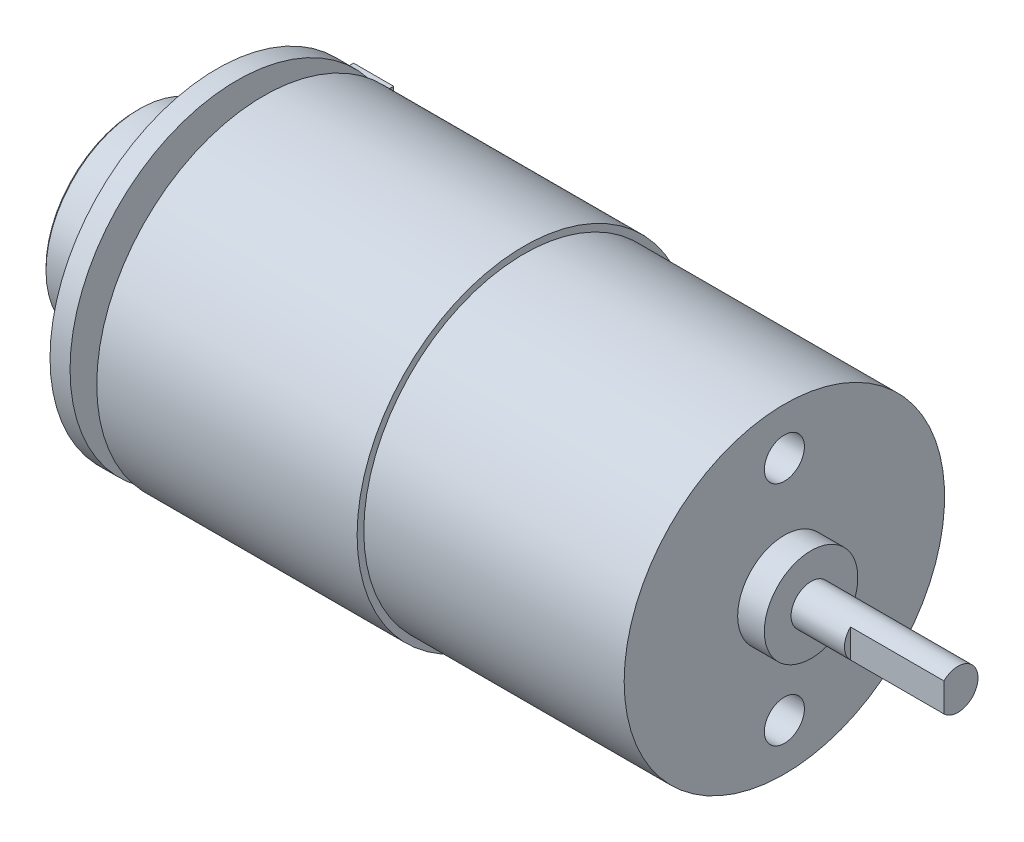
ISO-10303-21;
HEADER;
FILE_DESCRIPTION(('STEP AP214'),'2;1');
FILE_NAME('part.step','',(''),(''),'','','');
FILE_SCHEMA(('AUTOMOTIVE_DESIGN { 1 0 10303 214 1 1 1 1 }'));
ENDSEC;
DATA;
#1=APPLICATION_CONTEXT('core data for automotive mechanical design processes');
#2=APPLICATION_PROTOCOL_DEFINITION('international standard','automotive_design',2000,#1);
#3=PRODUCT_CONTEXT('',#1,'mechanical');
#4=PRODUCT('Part','Part','',(#3));
#5=PRODUCT_RELATED_PRODUCT_CATEGORY('part','',(#4));
#6=PRODUCT_DEFINITION_FORMATION('','',#4);
#7=PRODUCT_DEFINITION_CONTEXT('part definition',#1,'design');
#8=PRODUCT_DEFINITION('design','',#6,#7);
#9=PRODUCT_DEFINITION_SHAPE('','',#8);
#10=(LENGTH_UNIT() NAMED_UNIT(*) SI_UNIT(.MILLI.,.METRE.));
#11=(NAMED_UNIT(*) PLANE_ANGLE_UNIT() SI_UNIT($,.RADIAN.));
#12=(NAMED_UNIT(*) SI_UNIT($,.STERADIAN.) SOLID_ANGLE_UNIT());
#13=UNCERTAINTY_MEASURE_WITH_UNIT(LENGTH_MEASURE(1.E-05),#10,'distance_accuracy_value','');
#14=(GEOMETRIC_REPRESENTATION_CONTEXT(3) GLOBAL_UNCERTAINTY_ASSIGNED_CONTEXT((#13)) GLOBAL_UNIT_ASSIGNED_CONTEXT((#10,
#11,#12)) REPRESENTATION_CONTEXT('',''));
#15=CARTESIAN_POINT('',(0.,0.,0.));
#16=DIRECTION('',(0.,0.,1.));
#17=DIRECTION('',(1.,0.,0.));
#18=AXIS2_PLACEMENT_3D('',#15,#16,#17);
#19=CARTESIAN_POINT('',(-23.,0.,0.));
#20=DIRECTION('',(-1.,0.,0.));
#21=DIRECTION('',(0.,0.,1.));
#22=AXIS2_PLACEMENT_3D('',#19,#20,#21);
#23=PLANE('',#22);
#24=CARTESIAN_POINT('',(-23.,0.,0.));
#25=DIRECTION('',(-1.,0.,0.));
#26=DIRECTION('',(0.,0.,1.));
#27=AXIS2_PLACEMENT_3D('',#24,#25,#26);
#28=CIRCLE('',#27,0.5);
#29=CARTESIAN_POINT('',(-23.,0.,0.5));
#30=VERTEX_POINT('',#29);
#31=EDGE_CURVE('E419',#30,#30,#28,.T.);
#32=ORIENTED_EDGE('',*,*,#31,.F.);
#33=EDGE_LOOP('',(#32));
#34=FACE_BOUND('',#33,.T.);
#35=CARTESIAN_POINT('',(-23.,0.,0.));
#36=DIRECTION('',(-1.,0.,0.));
#37=DIRECTION('',(0.,0.,1.));
#38=AXIS2_PLACEMENT_3D('',#35,#36,#37);
#39=CIRCLE('',#38,12.5);
#40=CARTESIAN_POINT('',(-23.,-4.74918821401504,-11.5626645418719));
#41=VERTEX_POINT('',#40);
#42=CARTESIAN_POINT('',(-23.,4.74918821401504,-11.5626645418719));
#43=VERTEX_POINT('',#42);
#44=EDGE_CURVE('E416',#41,#43,#39,.T.);
#45=ORIENTED_EDGE('',*,*,#44,.T.);
#46=DIRECTION('',(0.,0.,-1.));
#47=VECTOR('',#46,1.);
#48=CARTESIAN_POINT('',(-23.,4.74918821401504,-8.23495804949627));
#49=LINE('',#48,#47);
#50=CARTESIAN_POINT('',(-23.,4.74918821401504,-8.23495804949627));
#51=VERTEX_POINT('',#50);
#52=EDGE_CURVE('E446',#51,#43,#49,.T.);
#53=ORIENTED_EDGE('',*,*,#52,.F.);
#54=DIRECTION('',(0.,1.,0.));
#55=VECTOR('',#54,1.);
#56=CARTESIAN_POINT('',(-23.,-4.74918821401504,-8.23495804949627));
#57=LINE('',#56,#55);
#58=CARTESIAN_POINT('',(-23.,-4.74918821401504,-8.23495804949627));
#59=VERTEX_POINT('',#58);
#60=EDGE_CURVE('E438',#59,#51,#57,.T.);
#61=ORIENTED_EDGE('',*,*,#60,.F.);
#62=DIRECTION('',(0.,0.,-1.));
#63=VECTOR('',#62,1.);
#64=CARTESIAN_POINT('',(-23.,-4.74918821401504,0.));
#65=LINE('',#64,#63);
#66=EDGE_CURVE('E164',#59,#41,#65,.T.);
#67=ORIENTED_EDGE('',*,*,#66,.T.);
#68=EDGE_LOOP('',(#45,#53,#61,#67));
#69=FACE_BOUND('',#68,.T.);
#70=ADVANCED_FACE('F39',(#34,#69),#23,.T.);
#71=CARTESIAN_POINT('',(-19.5,12.5,0.));
#72=DIRECTION('',(1.,0.,0.));
#73=DIRECTION('',(0.,0.,-1.));
#74=AXIS2_PLACEMENT_3D('',#71,#72,#73);
#75=PLANE('',#74);
#76=DIRECTION('',(0.,1.,0.));
#77=VECTOR('',#76,1.);
#78=CARTESIAN_POINT('',(-19.5,1.5,-9.15466330411358));
#79=LINE('',#78,#77);
#80=CARTESIAN_POINT('',(-19.5,-1.5,-9.15466330411358));
#81=VERTEX_POINT('',#80);
#82=CARTESIAN_POINT('',(-19.5,1.5,-9.15466330411358));
#83=VERTEX_POINT('',#82);
#84=EDGE_CURVE('E363',#81,#83,#79,.T.);
#85=ORIENTED_EDGE('',*,*,#84,.F.);
#86=DIRECTION('',(0.,0.,1.));
#87=VECTOR('',#86,1.);
#88=CARTESIAN_POINT('',(-19.5,-1.5,-9.65466330411358));
#89=LINE('',#88,#87);
#90=CARTESIAN_POINT('',(-19.5,-1.5,-9.65466330411358));
#91=VERTEX_POINT('',#90);
#92=EDGE_CURVE('E353',#91,#81,#89,.T.);
#93=ORIENTED_EDGE('',*,*,#92,.F.);
#94=DIRECTION('',(0.,-1.,0.));
#95=VECTOR('',#94,1.);
#96=CARTESIAN_POINT('',(-19.5,1.5,-9.65466330411358));
#97=LINE('',#96,#95);
#98=CARTESIAN_POINT('',(-19.5,1.5,-9.65466330411358));
#99=VERTEX_POINT('',#98);
#100=EDGE_CURVE('E357',#99,#91,#97,.T.);
#101=ORIENTED_EDGE('',*,*,#100,.F.);
#102=DIRECTION('',(0.,0.,-1.));
#103=VECTOR('',#102,1.);
#104=CARTESIAN_POINT('',(-19.5,1.5,-9.65466330411358));
#105=LINE('',#104,#103);
#106=EDGE_CURVE('E360',#83,#99,#105,.T.);
#107=ORIENTED_EDGE('',*,*,#106,.F.);
#108=EDGE_LOOP('',(#85,#93,#101,#107));
#109=FACE_BOUND('',#108,.T.);
#110=CARTESIAN_POINT('',(-19.5,0.,0.));
#111=DIRECTION('',(-1.,0.,0.));
#112=DIRECTION('',(0.,0.,1.));
#113=AXIS2_PLACEMENT_3D('',#110,#111,#112);
#114=CIRCLE('',#113,12.5);
#115=CARTESIAN_POINT('',(-19.5,0.,12.5));
#116=VERTEX_POINT('',#115);
#117=EDGE_CURVE('E160',#116,#116,#114,.T.);
#118=ORIENTED_EDGE('',*,*,#117,.T.);
#119=EDGE_LOOP('',(#118));
#120=FACE_BOUND('',#119,.T.);
#121=DIRECTION('',(0.,1.,0.));
#122=VECTOR('',#121,1.);
#123=CARTESIAN_POINT('',(-19.5,1.5,9.65466330411358));
#124=LINE('',#123,#122);
#125=CARTESIAN_POINT('',(-19.5,-1.5,9.65466330411358));
#126=VERTEX_POINT('',#125);
#127=CARTESIAN_POINT('',(-19.5,1.5,9.65466330411358));
#128=VERTEX_POINT('',#127);
#129=EDGE_CURVE('E399',#126,#128,#124,.T.);
#130=ORIENTED_EDGE('',*,*,#129,.F.);
#131=DIRECTION('',(0.,0.,1.));
#132=VECTOR('',#131,1.);
#133=CARTESIAN_POINT('',(-19.5,-1.5,9.65466330411358));
#134=LINE('',#133,#132);
#135=CARTESIAN_POINT('',(-19.5,-1.5,9.15466330411358));
#136=VERTEX_POINT('',#135);
#137=EDGE_CURVE('E389',#136,#126,#134,.T.);
#138=ORIENTED_EDGE('',*,*,#137,.F.);
#139=DIRECTION('',(0.,-1.,0.));
#140=VECTOR('',#139,1.);
#141=CARTESIAN_POINT('',(-19.5,1.5,9.15466330411358));
#142=LINE('',#141,#140);
#143=CARTESIAN_POINT('',(-19.5,1.5,9.15466330411358));
#144=VERTEX_POINT('',#143);
#145=EDGE_CURVE('E393',#144,#136,#142,.T.);
#146=ORIENTED_EDGE('',*,*,#145,.F.);
#147=DIRECTION('',(0.,0.,-1.));
#148=VECTOR('',#147,1.);
#149=CARTESIAN_POINT('',(-19.5,1.5,9.65466330411358));
#150=LINE('',#149,#148);
#151=EDGE_CURVE('E396',#128,#144,#150,.T.);
#152=ORIENTED_EDGE('',*,*,#151,.F.);
#153=EDGE_LOOP('',(#130,#138,#146,#152));
#154=FACE_BOUND('',#153,.T.);
#155=ADVANCED_FACE('F204',(#109,#120,#154),#75,.F.);
#156=CARTESIAN_POINT('',(-61.9655819569152,0.,0.));
#157=DIRECTION('',(-1.,0.,0.));
#158=DIRECTION('',(0.,0.,1.));
#159=AXIS2_PLACEMENT_3D('',#156,#157,#158);
#160=CYLINDRICAL_SURFACE('',#159,12.5);
#161=ORIENTED_EDGE('',*,*,#117,.F.);
#162=EDGE_LOOP('',(#161));
#163=FACE_BOUND('',#162,.T.);
#164=CARTESIAN_POINT('',(0.,0.,0.));
#165=DIRECTION('',(-1.,0.,0.));
#166=DIRECTION('',(0.,0.,1.));
#167=AXIS2_PLACEMENT_3D('',#164,#165,#166);
#168=CIRCLE('',#167,12.5);
#169=CARTESIAN_POINT('',(0.,0.,12.5));
#170=VERTEX_POINT('',#169);
#171=EDGE_CURVE('E306',#170,#170,#168,.T.);
#172=ORIENTED_EDGE('',*,*,#171,.T.);
#173=EDGE_LOOP('',(#172));
#174=FACE_BOUND('',#173,.T.);
#175=ADVANCED_FACE('F210',(#163,#174),#160,.T.);
#176=CARTESIAN_POINT('',(32.5,0.,0.));
#177=DIRECTION('',(-1.,0.,0.));
#178=DIRECTION('',(0.,0.,1.));
#179=AXIS2_PLACEMENT_3D('',#176,#177,#178);
#180=PLANE('',#179);
#181=CARTESIAN_POINT('',(32.5,0.,0.));
#182=DIRECTION('',(-1.,0.,0.));
#183=DIRECTION('',(0.,0.,1.));
#184=AXIS2_PLACEMENT_3D('',#181,#182,#183);
#185=CIRCLE('',#184,1.5);
#186=CARTESIAN_POINT('',(32.5,1.07121426428143,1.05));
#187=VERTEX_POINT('',#186);
#188=CARTESIAN_POINT('',(32.5,-1.07121426428143,1.05));
#189=VERTEX_POINT('',#188);
#190=EDGE_CURVE('E158',#187,#189,#185,.T.);
#191=ORIENTED_EDGE('',*,*,#190,.F.);
#192=DIRECTION('',(0.,1.,0.));
#193=VECTOR('',#192,1.);
#194=CARTESIAN_POINT('',(32.5,-12.5,1.05));
#195=LINE('',#194,#193);
#196=EDGE_CURVE('E54',#189,#187,#195,.T.);
#197=ORIENTED_EDGE('',*,*,#196,.F.);
#198=EDGE_LOOP('',(#191,#197));
#199=FACE_BOUND('',#198,.T.);
#200=ADVANCED_FACE('F295',(#199),#180,.F.);
#201=CARTESIAN_POINT('',(-61.9655819569152,0.,0.));
#202=DIRECTION('',(-1.,0.,0.));
#203=DIRECTION('',(0.,0.,1.));
#204=AXIS2_PLACEMENT_3D('',#201,#202,#203);
#205=CYLINDRICAL_SURFACE('',#204,1.5);
#206=CARTESIAN_POINT('',(21.5,0.,0.));
#207=DIRECTION('',(-1.,0.,0.));
#208=DIRECTION('',(0.,0.,1.));
#209=AXIS2_PLACEMENT_3D('',#206,#207,#208);
#210=CIRCLE('',#209,1.5);
#211=CARTESIAN_POINT('',(21.5,0.,1.5));
#212=VERTEX_POINT('',#211);
#213=EDGE_CURVE('E161',#212,#212,#210,.T.);
#214=ORIENTED_EDGE('',*,*,#213,.F.);
#215=EDGE_LOOP('',(#214));
#216=FACE_BOUND('',#215,.T.);
#217=DIRECTION('',(-1.,0.,0.));
#218=VECTOR('',#217,1.);
#219=CARTESIAN_POINT('',(-61.9655819569152,-1.07121426428143,1.05));
#220=LINE('',#219,#218);
#221=CARTESIAN_POINT('',(25.5,-1.07121426428143,1.05));
#222=VERTEX_POINT('',#221);
#223=EDGE_CURVE('E11',#189,#222,#220,.T.);
#224=ORIENTED_EDGE('',*,*,#223,.T.);
#225=CARTESIAN_POINT('',(25.5,0.,0.));
#226=DIRECTION('',(-1.,0.,0.));
#227=DIRECTION('',(0.,0.,1.));
#228=AXIS2_PLACEMENT_3D('',#225,#226,#227);
#229=CIRCLE('',#228,1.5);
#230=CARTESIAN_POINT('',(25.5,1.07121426428143,1.05));
#231=VERTEX_POINT('',#230);
#232=EDGE_CURVE('E47',#222,#231,#229,.T.);
#233=ORIENTED_EDGE('',*,*,#232,.T.);
#234=DIRECTION('',(-1.,0.,0.));
#235=VECTOR('',#234,1.);
#236=CARTESIAN_POINT('',(-61.9655819569152,1.07121426428143,1.05));
#237=LINE('',#236,#235);
#238=EDGE_CURVE('E151',#231,#187,#237,.F.);
#239=ORIENTED_EDGE('',*,*,#238,.T.);
#240=ORIENTED_EDGE('',*,*,#190,.T.);
#241=EDGE_LOOP('',(#224,#233,#239,#240));
#242=FACE_BOUND('',#241,.T.);
#243=ADVANCED_FACE('F156',(#216,#242),#205,.T.);
#244=CARTESIAN_POINT('',(21.5,1.5,0.));
#245=DIRECTION('',(-1.,0.,0.));
#246=DIRECTION('',(0.,0.,1.));
#247=AXIS2_PLACEMENT_3D('',#244,#245,#246);
#248=PLANE('',#247);
#249=CARTESIAN_POINT('',(21.5,0.,0.));
#250=DIRECTION('',(-1.,0.,0.));
#251=DIRECTION('',(0.,0.,1.));
#252=AXIS2_PLACEMENT_3D('',#249,#250,#251);
#253=CIRCLE('',#252,3.5);
#254=CARTESIAN_POINT('',(21.5,0.,3.5));
#255=VERTEX_POINT('',#254);
#256=EDGE_CURVE('E167',#255,#255,#253,.T.);
#257=ORIENTED_EDGE('',*,*,#256,.F.);
#258=EDGE_LOOP('',(#257));
#259=FACE_BOUND('',#258,.T.);
#260=ORIENTED_EDGE('',*,*,#213,.T.);
#261=EDGE_LOOP('',(#260));
#262=FACE_BOUND('',#261,.T.);
#263=ADVANCED_FACE('F288',(#259,#262),#248,.F.);
#264=CARTESIAN_POINT('',(-61.9655819569152,0.,0.));
#265=DIRECTION('',(-1.,0.,0.));
#266=DIRECTION('',(0.,0.,1.));
#267=AXIS2_PLACEMENT_3D('',#264,#265,#266);
#268=CYLINDRICAL_SURFACE('',#267,3.5);
#269=CARTESIAN_POINT('',(19.5,0.,0.));
#270=DIRECTION('',(-1.,0.,0.));
#271=DIRECTION('',(0.,0.,1.));
#272=AXIS2_PLACEMENT_3D('',#269,#270,#271);
#273=CIRCLE('',#272,3.5);
#274=CARTESIAN_POINT('',(19.5,0.,3.5));
#275=VERTEX_POINT('',#274);
#276=EDGE_CURVE('E320',#275,#275,#273,.T.);
#277=ORIENTED_EDGE('',*,*,#276,.F.);
#278=EDGE_LOOP('',(#277));
#279=FACE_BOUND('',#278,.T.);
#280=ORIENTED_EDGE('',*,*,#256,.T.);
#281=EDGE_LOOP('',(#280));
#282=FACE_BOUND('',#281,.T.);
#283=ADVANCED_FACE('F284',(#279,#282),#268,.T.);
#284=CARTESIAN_POINT('',(19.5,3.5,0.));
#285=DIRECTION('',(-1.,0.,0.));
#286=DIRECTION('',(0.,0.,1.));
#287=AXIS2_PLACEMENT_3D('',#284,#285,#286);
#288=PLANE('',#287);
#289=CARTESIAN_POINT('',(19.5,8.5,0.));
#290=DIRECTION('',(1.,0.,0.));
#291=DIRECTION('',(0.,0.,1.));
#292=AXIS2_PLACEMENT_3D('',#289,#290,#291);
#293=CIRCLE('',#292,1.5);
#294=CARTESIAN_POINT('',(19.5,8.5,1.5));
#295=VERTEX_POINT('',#294);
#296=EDGE_CURVE('E335',#295,#295,#293,.T.);
#297=ORIENTED_EDGE('',*,*,#296,.F.);
#298=EDGE_LOOP('',(#297));
#299=FACE_BOUND('',#298,.T.);
#300=CARTESIAN_POINT('',(19.5,-8.5,0.));
#301=DIRECTION('',(1.,0.,0.));
#302=DIRECTION('',(0.,0.,-1.));
#303=AXIS2_PLACEMENT_3D('',#300,#301,#302);
#304=CIRCLE('',#303,1.5);
#305=CARTESIAN_POINT('',(19.5,-8.5,-1.5));
#306=VERTEX_POINT('',#305);
#307=EDGE_CURVE('E314',#306,#306,#304,.T.);
#308=ORIENTED_EDGE('',*,*,#307,.F.);
#309=EDGE_LOOP('',(#308));
#310=FACE_BOUND('',#309,.T.);
#311=CARTESIAN_POINT('',(19.5,0.,0.));
#312=DIRECTION('',(-1.,0.,0.));
#313=DIRECTION('',(0.,0.,1.));
#314=AXIS2_PLACEMENT_3D('',#311,#312,#313);
#315=CIRCLE('',#314,12.);
#316=CARTESIAN_POINT('',(19.5,0.,12.));
#317=VERTEX_POINT('',#316);
#318=EDGE_CURVE('E311',#317,#317,#315,.T.);
#319=ORIENTED_EDGE('',*,*,#318,.F.);
#320=EDGE_LOOP('',(#319));
#321=FACE_BOUND('',#320,.T.);
#322=ORIENTED_EDGE('',*,*,#276,.T.);
#323=EDGE_LOOP('',(#322));
#324=FACE_BOUND('',#323,.T.);
#325=ADVANCED_FACE('F280',(#299,#310,#321,#324),#288,.F.);
#326=CARTESIAN_POINT('',(-61.9655819569152,0.,0.));
#327=DIRECTION('',(-1.,0.,0.));
#328=DIRECTION('',(0.,0.,1.));
#329=AXIS2_PLACEMENT_3D('',#326,#327,#328);
#330=CYLINDRICAL_SURFACE('',#329,12.);
#331=CARTESIAN_POINT('',(0.,0.,0.));
#332=DIRECTION('',(-1.,0.,0.));
#333=DIRECTION('',(0.,0.,1.));
#334=AXIS2_PLACEMENT_3D('',#331,#332,#333);
#335=CIRCLE('',#334,12.);
#336=CARTESIAN_POINT('',(0.,0.,12.));
#337=VERTEX_POINT('',#336);
#338=EDGE_CURVE('E307',#337,#337,#335,.T.);
#339=ORIENTED_EDGE('',*,*,#338,.F.);
#340=EDGE_LOOP('',(#339));
#341=FACE_BOUND('',#340,.T.);
#342=ORIENTED_EDGE('',*,*,#318,.T.);
#343=EDGE_LOOP('',(#342));
#344=FACE_BOUND('',#343,.T.);
#345=ADVANCED_FACE('F276',(#341,#344),#330,.T.);
#346=CARTESIAN_POINT('',(0.,12.,0.));
#347=DIRECTION('',(-1.,0.,0.));
#348=DIRECTION('',(0.,0.,1.));
#349=AXIS2_PLACEMENT_3D('',#346,#347,#348);
#350=PLANE('',#349);
#351=ORIENTED_EDGE('',*,*,#171,.F.);
#352=EDGE_LOOP('',(#351));
#353=FACE_BOUND('',#352,.T.);
#354=ORIENTED_EDGE('',*,*,#338,.T.);
#355=EDGE_LOOP('',(#354));
#356=FACE_BOUND('',#355,.T.);
#357=ADVANCED_FACE('F272',(#353,#356),#350,.F.);
#358=CARTESIAN_POINT('',(16.5,-8.5,0.));
#359=DIRECTION('',(1.,0.,0.));
#360=DIRECTION('',(0.,0.,-1.));
#361=AXIS2_PLACEMENT_3D('',#358,#359,#360);
#362=CYLINDRICAL_SURFACE('',#361,1.5);
#363=CARTESIAN_POINT('',(16.5,-8.5,0.));
#364=DIRECTION('',(1.,0.,0.));
#365=DIRECTION('',(0.,0.,-1.));
#366=AXIS2_PLACEMENT_3D('',#363,#364,#365);
#367=CIRCLE('',#366,1.5);
#368=CARTESIAN_POINT('',(16.5,-8.5,-1.5));
#369=VERTEX_POINT('',#368);
#370=EDGE_CURVE('E308',#369,#369,#367,.T.);
#371=ORIENTED_EDGE('',*,*,#370,.F.);
#372=EDGE_LOOP('',(#371));
#373=FACE_BOUND('',#372,.T.);
#374=ORIENTED_EDGE('',*,*,#307,.T.);
#375=EDGE_LOOP('',(#374));
#376=FACE_BOUND('',#375,.T.);
#377=ADVANCED_FACE('F268',(#373,#376),#362,.F.);
#378=CARTESIAN_POINT('',(16.5,-8.5,0.));
#379=DIRECTION('',(1.,0.,0.));
#380=DIRECTION('',(0.,0.,-1.));
#381=AXIS2_PLACEMENT_3D('',#378,#379,#380);
#382=PLANE('',#381);
#383=ORIENTED_EDGE('',*,*,#370,.T.);
#384=EDGE_LOOP('',(#383));
#385=FACE_BOUND('',#384,.T.);
#386=ADVANCED_FACE('F264',(#385),#382,.T.);
#387=CARTESIAN_POINT('',(16.5,8.5,0.));
#388=DIRECTION('',(1.,0.,0.));
#389=DIRECTION('',(0.,0.,-1.));
#390=AXIS2_PLACEMENT_3D('',#387,#388,#389);
#391=CYLINDRICAL_SURFACE('',#390,1.5);
#392=CARTESIAN_POINT('',(16.5,8.5,0.));
#393=DIRECTION('',(1.,0.,0.));
#394=DIRECTION('',(0.,0.,1.));
#395=AXIS2_PLACEMENT_3D('',#392,#393,#394);
#396=CIRCLE('',#395,1.5);
#397=CARTESIAN_POINT('',(16.5,8.5,1.5));
#398=VERTEX_POINT('',#397);
#399=EDGE_CURVE('E333',#398,#398,#396,.T.);
#400=ORIENTED_EDGE('',*,*,#399,.F.);
#401=EDGE_LOOP('',(#400));
#402=FACE_BOUND('',#401,.T.);
#403=ORIENTED_EDGE('',*,*,#296,.T.);
#404=EDGE_LOOP('',(#403));
#405=FACE_BOUND('',#404,.T.);
#406=ADVANCED_FACE('F260',(#402,#405),#391,.F.);
#407=CARTESIAN_POINT('',(16.5,8.5,0.));
#408=DIRECTION('',(-1.,0.,0.));
#409=DIRECTION('',(0.,0.,1.));
#410=AXIS2_PLACEMENT_3D('',#407,#408,#409);
#411=PLANE('',#410);
#412=ORIENTED_EDGE('',*,*,#399,.T.);
#413=EDGE_LOOP('',(#412));
#414=FACE_BOUND('',#413,.T.);
#415=ADVANCED_FACE('F256',(#414),#411,.F.);
#416=CARTESIAN_POINT('',(-21.5,1.5,-9.15466330411358));
#417=DIRECTION('',(0.,0.,-1.));
#418=DIRECTION('',(-1.,0.,0.));
#419=AXIS2_PLACEMENT_3D('',#416,#417,#418);
#420=PLANE('',#419);
#421=ORIENTED_EDGE('',*,*,#84,.T.);
#422=DIRECTION('',(1.,0.,0.));
#423=VECTOR('',#422,1.);
#424=CARTESIAN_POINT('',(-21.5,1.5,-9.15466330411358));
#425=LINE('',#424,#423);
#426=CARTESIAN_POINT('',(-21.5,1.5,-9.15466330411358));
#427=VERTEX_POINT('',#426);
#428=EDGE_CURVE('E338',#427,#83,#425,.T.);
#429=ORIENTED_EDGE('',*,*,#428,.F.);
#430=DIRECTION('',(0.,1.,0.));
#431=VECTOR('',#430,1.);
#432=CARTESIAN_POINT('',(-21.5,1.5,-9.15466330411358));
#433=LINE('',#432,#431);
#434=CARTESIAN_POINT('',(-21.5,-1.5,-9.15466330411358));
#435=VERTEX_POINT('',#434);
#436=EDGE_CURVE('E356',#435,#427,#433,.T.);
#437=ORIENTED_EDGE('',*,*,#436,.F.);
#438=DIRECTION('',(1.,0.,0.));
#439=VECTOR('',#438,1.);
#440=CARTESIAN_POINT('',(-21.5,-1.5,-9.15466330411358));
#441=LINE('',#440,#439);
#442=EDGE_CURVE('E349',#435,#81,#441,.T.);
#443=ORIENTED_EDGE('',*,*,#442,.T.);
#444=EDGE_LOOP('',(#421,#429,#437,#443));
#445=FACE_BOUND('',#444,.T.);
#446=ADVANCED_FACE('F252',(#445),#420,.F.);
#447=CARTESIAN_POINT('',(-21.5,1.5,-9.65466330411358));
#448=DIRECTION('',(0.,-1.,0.));
#449=DIRECTION('',(0.,0.,-1.));
#450=AXIS2_PLACEMENT_3D('',#447,#448,#449);
#451=PLANE('',#450);
#452=ORIENTED_EDGE('',*,*,#106,.T.);
#453=DIRECTION('',(1.,0.,0.));
#454=VECTOR('',#453,1.);
#455=CARTESIAN_POINT('',(-21.5,1.5,-9.65466330411358));
#456=LINE('',#455,#454);
#457=CARTESIAN_POINT('',(-21.5,1.5,-9.65466330411358));
#458=VERTEX_POINT('',#457);
#459=EDGE_CURVE('E343',#458,#99,#456,.T.);
#460=ORIENTED_EDGE('',*,*,#459,.F.);
#461=DIRECTION('',(0.,0.,-1.));
#462=VECTOR('',#461,1.);
#463=CARTESIAN_POINT('',(-21.5,1.5,-9.65466330411358));
#464=LINE('',#463,#462);
#465=EDGE_CURVE('E372',#427,#458,#464,.T.);
#466=ORIENTED_EDGE('',*,*,#465,.F.);
#467=ORIENTED_EDGE('',*,*,#428,.T.);
#468=EDGE_LOOP('',(#452,#460,#466,#467));
#469=FACE_BOUND('',#468,.T.);
#470=ADVANCED_FACE('F248',(#469),#451,.F.);
#471=CARTESIAN_POINT('',(-21.5,1.5,-9.65466330411358));
#472=DIRECTION('',(0.,0.,1.));
#473=DIRECTION('',(1.,0.,0.));
#474=AXIS2_PLACEMENT_3D('',#471,#472,#473);
#475=PLANE('',#474);
#476=ORIENTED_EDGE('',*,*,#100,.T.);
#477=DIRECTION('',(1.,0.,0.));
#478=VECTOR('',#477,1.);
#479=CARTESIAN_POINT('',(-21.5,-1.5,-9.65466330411358));
#480=LINE('',#479,#478);
#481=CARTESIAN_POINT('',(-21.5,-1.5,-9.65466330411358));
#482=VERTEX_POINT('',#481);
#483=EDGE_CURVE('E346',#482,#91,#480,.T.);
#484=ORIENTED_EDGE('',*,*,#483,.F.);
#485=DIRECTION('',(0.,-1.,0.));
#486=VECTOR('',#485,1.);
#487=CARTESIAN_POINT('',(-21.5,1.5,-9.65466330411358));
#488=LINE('',#487,#486);
#489=EDGE_CURVE('E369',#458,#482,#488,.T.);
#490=ORIENTED_EDGE('',*,*,#489,.F.);
#491=ORIENTED_EDGE('',*,*,#459,.T.);
#492=EDGE_LOOP('',(#476,#484,#490,#491));
#493=FACE_BOUND('',#492,.T.);
#494=ADVANCED_FACE('F244',(#493),#475,.F.);
#495=CARTESIAN_POINT('',(-21.5,-1.5,-9.65466330411358));
#496=DIRECTION('',(0.,1.,0.));
#497=DIRECTION('',(0.,0.,1.));
#498=AXIS2_PLACEMENT_3D('',#495,#496,#497);
#499=PLANE('',#498);
#500=ORIENTED_EDGE('',*,*,#92,.T.);
#501=ORIENTED_EDGE('',*,*,#442,.F.);
#502=DIRECTION('',(0.,0.,1.));
#503=VECTOR('',#502,1.);
#504=CARTESIAN_POINT('',(-21.5,-1.5,-9.65466330411358));
#505=LINE('',#504,#503);
#506=EDGE_CURVE('E352',#482,#435,#505,.T.);
#507=ORIENTED_EDGE('',*,*,#506,.F.);
#508=ORIENTED_EDGE('',*,*,#483,.T.);
#509=EDGE_LOOP('',(#500,#501,#507,#508));
#510=FACE_BOUND('',#509,.T.);
#511=ADVANCED_FACE('F240',(#510),#499,.F.);
#512=CARTESIAN_POINT('',(-21.5,1.5,9.65466330411358));
#513=DIRECTION('',(0.,0.,-1.));
#514=DIRECTION('',(-1.,0.,0.));
#515=AXIS2_PLACEMENT_3D('',#512,#513,#514);
#516=PLANE('',#515);
#517=ORIENTED_EDGE('',*,*,#129,.T.);
#518=DIRECTION('',(1.,0.,0.));
#519=VECTOR('',#518,1.);
#520=CARTESIAN_POINT('',(-21.5,1.5,9.65466330411358));
#521=LINE('',#520,#519);
#522=CARTESIAN_POINT('',(-21.5,1.5,9.65466330411358));
#523=VERTEX_POINT('',#522);
#524=EDGE_CURVE('E366',#523,#128,#521,.T.);
#525=ORIENTED_EDGE('',*,*,#524,.F.);
#526=DIRECTION('',(0.,1.,0.));
#527=VECTOR('',#526,1.);
#528=CARTESIAN_POINT('',(-21.5,1.5,9.65466330411358));
#529=LINE('',#528,#527);
#530=CARTESIAN_POINT('',(-21.5,-1.5,9.65466330411358));
#531=VERTEX_POINT('',#530);
#532=EDGE_CURVE('E392',#531,#523,#529,.T.);
#533=ORIENTED_EDGE('',*,*,#532,.F.);
#534=DIRECTION('',(1.,0.,0.));
#535=VECTOR('',#534,1.);
#536=CARTESIAN_POINT('',(-21.5,-1.5,9.65466330411358));
#537=LINE('',#536,#535);
#538=EDGE_CURVE('E385',#531,#126,#537,.T.);
#539=ORIENTED_EDGE('',*,*,#538,.T.);
#540=EDGE_LOOP('',(#517,#525,#533,#539));
#541=FACE_BOUND('',#540,.T.);
#542=ADVANCED_FACE('F236',(#541),#516,.F.);
#543=CARTESIAN_POINT('',(-21.5,1.5,9.65466330411358));
#544=DIRECTION('',(0.,-1.,0.));
#545=DIRECTION('',(0.,0.,-1.));
#546=AXIS2_PLACEMENT_3D('',#543,#544,#545);
#547=PLANE('',#546);
#548=ORIENTED_EDGE('',*,*,#151,.T.);
#549=DIRECTION('',(1.,0.,0.));
#550=VECTOR('',#549,1.);
#551=CARTESIAN_POINT('',(-21.5,1.5,9.15466330411358));
#552=LINE('',#551,#550);
#553=CARTESIAN_POINT('',(-21.5,1.5,9.15466330411358));
#554=VERTEX_POINT('',#553);
#555=EDGE_CURVE('E379',#554,#144,#552,.T.);
#556=ORIENTED_EDGE('',*,*,#555,.F.);
#557=DIRECTION('',(0.,0.,-1.));
#558=VECTOR('',#557,1.);
#559=CARTESIAN_POINT('',(-21.5,1.5,9.65466330411358));
#560=LINE('',#559,#558);
#561=EDGE_CURVE('E408',#523,#554,#560,.T.);
#562=ORIENTED_EDGE('',*,*,#561,.F.);
#563=ORIENTED_EDGE('',*,*,#524,.T.);
#564=EDGE_LOOP('',(#548,#556,#562,#563));
#565=FACE_BOUND('',#564,.T.);
#566=ADVANCED_FACE('F232',(#565),#547,.F.);
#567=CARTESIAN_POINT('',(-21.5,1.5,9.15466330411358));
#568=DIRECTION('',(0.,0.,1.));
#569=DIRECTION('',(1.,0.,0.));
#570=AXIS2_PLACEMENT_3D('',#567,#568,#569);
#571=PLANE('',#570);
#572=ORIENTED_EDGE('',*,*,#145,.T.);
#573=DIRECTION('',(1.,0.,0.));
#574=VECTOR('',#573,1.);
#575=CARTESIAN_POINT('',(-21.5,-1.5,9.15466330411358));
#576=LINE('',#575,#574);
#577=CARTESIAN_POINT('',(-21.5,-1.5,9.15466330411358));
#578=VERTEX_POINT('',#577);
#579=EDGE_CURVE('E382',#578,#136,#576,.T.);
#580=ORIENTED_EDGE('',*,*,#579,.F.);
#581=DIRECTION('',(0.,-1.,0.));
#582=VECTOR('',#581,1.);
#583=CARTESIAN_POINT('',(-21.5,1.5,9.15466330411358));
#584=LINE('',#583,#582);
#585=EDGE_CURVE('E405',#554,#578,#584,.T.);
#586=ORIENTED_EDGE('',*,*,#585,.F.);
#587=ORIENTED_EDGE('',*,*,#555,.T.);
#588=EDGE_LOOP('',(#572,#580,#586,#587));
#589=FACE_BOUND('',#588,.T.);
#590=ADVANCED_FACE('F228',(#589),#571,.F.);
#591=CARTESIAN_POINT('',(-21.5,-1.5,9.65466330411358));
#592=DIRECTION('',(0.,1.,0.));
#593=DIRECTION('',(0.,0.,1.));
#594=AXIS2_PLACEMENT_3D('',#591,#592,#593);
#595=PLANE('',#594);
#596=ORIENTED_EDGE('',*,*,#137,.T.);
#597=ORIENTED_EDGE('',*,*,#538,.F.);
#598=DIRECTION('',(0.,0.,1.));
#599=VECTOR('',#598,1.);
#600=CARTESIAN_POINT('',(-21.5,-1.5,9.65466330411358));
#601=LINE('',#600,#599);
#602=EDGE_CURVE('E388',#578,#531,#601,.T.);
#603=ORIENTED_EDGE('',*,*,#602,.F.);
#604=ORIENTED_EDGE('',*,*,#579,.T.);
#605=EDGE_LOOP('',(#596,#597,#603,#604));
#606=FACE_BOUND('',#605,.T.);
#607=ADVANCED_FACE('F221',(#606),#595,.F.);
#608=CARTESIAN_POINT('',(-21.5,0.,0.));
#609=DIRECTION('',(-1.,0.,0.));
#610=DIRECTION('',(0.,0.,1.));
#611=AXIS2_PLACEMENT_3D('',#608,#609,#610);
#612=PLANE('',#611);
#613=CARTESIAN_POINT('',(-21.5,0.,0.));
#614=DIRECTION('',(-1.,0.,0.));
#615=DIRECTION('',(0.,0.,1.));
#616=AXIS2_PLACEMENT_3D('',#613,#614,#615);
#617=CIRCLE('',#616,12.5);
#618=CARTESIAN_POINT('',(-21.5,0.,12.5));
#619=VERTEX_POINT('',#618);
#620=EDGE_CURVE('E413',#619,#619,#617,.T.);
#621=ORIENTED_EDGE('',*,*,#620,.F.);
#622=EDGE_LOOP('',(#621));
#623=FACE_BOUND('',#622,.T.);
#624=ORIENTED_EDGE('',*,*,#602,.T.);
#625=ORIENTED_EDGE('',*,*,#532,.T.);
#626=ORIENTED_EDGE('',*,*,#561,.T.);
#627=ORIENTED_EDGE('',*,*,#585,.T.);
#628=EDGE_LOOP('',(#624,#625,#626,#627));
#629=FACE_BOUND('',#628,.T.);
#630=ORIENTED_EDGE('',*,*,#506,.T.);
#631=ORIENTED_EDGE('',*,*,#436,.T.);
#632=ORIENTED_EDGE('',*,*,#465,.T.);
#633=ORIENTED_EDGE('',*,*,#489,.T.);
#634=EDGE_LOOP('',(#630,#631,#632,#633));
#635=FACE_BOUND('',#634,.T.);
#636=ADVANCED_FACE('F217',(#623,#629,#635),#612,.F.);
#637=CARTESIAN_POINT('',(-23.,0.,0.));
#638=DIRECTION('',(1.,0.,0.));
#639=DIRECTION('',(0.,0.,-1.));
#640=AXIS2_PLACEMENT_3D('',#637,#638,#639);
#641=CYLINDRICAL_SURFACE('',#640,12.5);
#642=EDGE_CURVE('E402',#43,#41,#39,.T.);
#643=ORIENTED_EDGE('',*,*,#642,.F.);
#644=ORIENTED_EDGE('',*,*,#44,.F.);
#645=EDGE_LOOP('',(#643,#644));
#646=FACE_BOUND('',#645,.T.);
#647=ORIENTED_EDGE('',*,*,#620,.T.);
#648=EDGE_LOOP('',(#647));
#649=FACE_BOUND('',#648,.T.);
#650=ADVANCED_FACE('F220',(#646,#649),#641,.T.);
#651=CARTESIAN_POINT('',(-24.,0.,0.));
#652=DIRECTION('',(1.,0.,0.));
#653=DIRECTION('',(0.,0.,-1.));
#654=AXIS2_PLACEMENT_3D('',#651,#652,#653);
#655=CYLINDRICAL_SURFACE('',#654,0.5);
#656=CARTESIAN_POINT('',(-24.,0.,0.));
#657=DIRECTION('',(-1.,0.,0.));
#658=DIRECTION('',(0.,0.,1.));
#659=AXIS2_PLACEMENT_3D('',#656,#657,#658);
#660=CIRCLE('',#659,0.5);
#661=CARTESIAN_POINT('',(-24.,0.,0.5));
#662=VERTEX_POINT('',#661);
#663=EDGE_CURVE('E417',#662,#662,#660,.T.);
#664=ORIENTED_EDGE('',*,*,#663,.F.);
#665=EDGE_LOOP('',(#664));
#666=FACE_BOUND('',#665,.T.);
#667=ORIENTED_EDGE('',*,*,#31,.T.);
#668=EDGE_LOOP('',(#667));
#669=FACE_BOUND('',#668,.T.);
#670=ADVANCED_FACE('F200',(#666,#669),#655,.T.);
#671=CARTESIAN_POINT('',(-29.,0.,0.));
#672=DIRECTION('',(1.,0.,0.));
#673=DIRECTION('',(0.,0.,-1.));
#674=AXIS2_PLACEMENT_3D('',#671,#672,#673);
#675=CYLINDRICAL_SURFACE('',#674,7.);
#676=CARTESIAN_POINT('',(-28.8,0.,0.));
#677=DIRECTION('',(-1.,0.,0.));
#678=DIRECTION('',(0.,0.,1.));
#679=AXIS2_PLACEMENT_3D('',#676,#677,#678);
#680=CIRCLE('',#679,7.);
#681=CARTESIAN_POINT('',(-28.8,0.,7.));
#682=VERTEX_POINT('',#681);
#683=EDGE_CURVE('E176',#682,#682,#680,.F.);
#684=ORIENTED_EDGE('',*,*,#683,.T.);
#685=EDGE_LOOP('',(#684));
#686=FACE_BOUND('',#685,.T.);
#687=CARTESIAN_POINT('',(-24.,0.,0.));
#688=DIRECTION('',(-1.,0.,0.));
#689=DIRECTION('',(0.,0.,1.));
#690=AXIS2_PLACEMENT_3D('',#687,#688,#689);
#691=CIRCLE('',#690,7.);
#692=CARTESIAN_POINT('',(-24.,0.,7.));
#693=VERTEX_POINT('',#692);
#694=EDGE_CURVE('E422',#693,#693,#691,.T.);
#695=ORIENTED_EDGE('',*,*,#694,.T.);
#696=EDGE_LOOP('',(#695));
#697=FACE_BOUND('',#696,.T.);
#698=ADVANCED_FACE('F181',(#686,#697),#675,.T.);
#699=CARTESIAN_POINT('',(-29.,0.,0.));
#700=DIRECTION('',(-1.,0.,0.));
#701=DIRECTION('',(0.,0.,1.));
#702=AXIS2_PLACEMENT_3D('',#699,#700,#701);
#703=PLANE('',#702);
#704=CARTESIAN_POINT('',(-29.,0.,0.));
#705=DIRECTION('',(-1.,0.,0.));
#706=DIRECTION('',(0.,0.,1.));
#707=AXIS2_PLACEMENT_3D('',#704,#705,#706);
#708=CIRCLE('',#707,6.79999999999999);
#709=CARTESIAN_POINT('',(-29.,0.,6.79999999999999));
#710=VERTEX_POINT('',#709);
#711=EDGE_CURVE('E173',#710,#710,#708,.T.);
#712=ORIENTED_EDGE('',*,*,#711,.T.);
#713=EDGE_LOOP('',(#712));
#714=FACE_BOUND('',#713,.T.);
#715=ADVANCED_FACE('F189',(#714),#703,.T.);
#716=CARTESIAN_POINT('',(-24.,0.,0.));
#717=DIRECTION('',(-1.,0.,0.));
#718=DIRECTION('',(0.,0.,1.));
#719=AXIS2_PLACEMENT_3D('',#716,#717,#718);
#720=PLANE('',#719);
#721=ORIENTED_EDGE('',*,*,#663,.T.);
#722=EDGE_LOOP('',(#721));
#723=FACE_BOUND('',#722,.T.);
#724=ORIENTED_EDGE('',*,*,#694,.F.);
#725=EDGE_LOOP('',(#724));
#726=FACE_BOUND('',#725,.T.);
#727=ADVANCED_FACE('F191',(#723,#726),#720,.F.);
#728=CARTESIAN_POINT('',(-26.,4.74918821401504,-8.23495804949627));
#729=DIRECTION('',(0.,-1.,0.));
#730=DIRECTION('',(0.,0.,-1.));
#731=AXIS2_PLACEMENT_3D('',#728,#729,#730);
#732=PLANE('',#731);
#733=ORIENTED_EDGE('',*,*,#52,.T.);
#734=CARTESIAN_POINT('',(-23.,4.74918821401504,-13.2349580494963));
#735=VERTEX_POINT('',#734);
#736=EDGE_CURVE('E153',#43,#735,#49,.T.);
#737=ORIENTED_EDGE('',*,*,#736,.T.);
#738=DIRECTION('',(1.,0.,0.));
#739=VECTOR('',#738,1.);
#740=CARTESIAN_POINT('',(-26.,4.74918821401504,-13.2349580494963));
#741=LINE('',#740,#739);
#742=CARTESIAN_POINT('',(-26.,4.74918821401504,-13.2349580494963));
#743=VERTEX_POINT('',#742);
#744=EDGE_CURVE('E427',#743,#735,#741,.T.);
#745=ORIENTED_EDGE('',*,*,#744,.F.);
#746=DIRECTION('',(0.,0.,-1.));
#747=VECTOR('',#746,1.);
#748=CARTESIAN_POINT('',(-26.,4.74918821401504,-8.23495804949627));
#749=LINE('',#748,#747);
#750=CARTESIAN_POINT('',(-26.,4.74918821401504,-8.23495804949627));
#751=VERTEX_POINT('',#750);
#752=EDGE_CURVE('E440',#751,#743,#749,.T.);
#753=ORIENTED_EDGE('',*,*,#752,.F.);
#754=DIRECTION('',(1.,0.,0.));
#755=VECTOR('',#754,1.);
#756=CARTESIAN_POINT('',(-26.,4.74918821401504,-8.23495804949627));
#757=LINE('',#756,#755);
#758=EDGE_CURVE('E434',#751,#51,#757,.T.);
#759=ORIENTED_EDGE('',*,*,#758,.T.);
#760=EDGE_LOOP('',(#733,#737,#745,#753,#759));
#761=FACE_BOUND('',#760,.T.);
#762=ADVANCED_FACE('F197',(#761),#732,.F.);
#763=CARTESIAN_POINT('',(-26.,4.74918821401504,-13.2349580494963));
#764=DIRECTION('',(0.,0.,1.));
#765=DIRECTION('',(1.,0.,0.));
#766=AXIS2_PLACEMENT_3D('',#763,#764,#765);
#767=PLANE('',#766);
#768=DIRECTION('',(0.,-1.,0.));
#769=VECTOR('',#768,1.);
#770=CARTESIAN_POINT('',(-23.,4.74918821401504,-13.2349580494963));
#771=LINE('',#770,#769);
#772=CARTESIAN_POINT('',(-23.,-4.74918821401504,-13.2349580494963));
#773=VERTEX_POINT('',#772);
#774=EDGE_CURVE('E444',#735,#773,#771,.T.);
#775=ORIENTED_EDGE('',*,*,#774,.T.);
#776=DIRECTION('',(1.,0.,0.));
#777=VECTOR('',#776,1.);
#778=CARTESIAN_POINT('',(-26.,-4.74918821401504,-13.2349580494963));
#779=LINE('',#778,#777);
#780=CARTESIAN_POINT('',(-26.,-4.74918821401504,-13.2349580494963));
#781=VERTEX_POINT('',#780);
#782=EDGE_CURVE('E430',#781,#773,#779,.T.);
#783=ORIENTED_EDGE('',*,*,#782,.F.);
#784=DIRECTION('',(0.,-1.,0.));
#785=VECTOR('',#784,1.);
#786=CARTESIAN_POINT('',(-26.,4.74918821401504,-13.2349580494963));
#787=LINE('',#786,#785);
#788=EDGE_CURVE('E452',#743,#781,#787,.T.);
#789=ORIENTED_EDGE('',*,*,#788,.F.);
#790=ORIENTED_EDGE('',*,*,#744,.T.);
#791=EDGE_LOOP('',(#775,#783,#789,#790));
#792=FACE_BOUND('',#791,.T.);
#793=ADVANCED_FACE('F465',(#792),#767,.F.);
#794=CARTESIAN_POINT('',(-26.,-4.74918821401504,-13.2349580494963));
#795=DIRECTION('',(0.,1.,0.));
#796=DIRECTION('',(0.,0.,1.));
#797=AXIS2_PLACEMENT_3D('',#794,#795,#796);
#798=PLANE('',#797);
#799=DIRECTION('',(0.,0.,1.));
#800=VECTOR('',#799,1.);
#801=CARTESIAN_POINT('',(-23.,-4.74918821401504,-13.2349580494963));
#802=LINE('',#801,#800);
#803=EDGE_CURVE('E441',#773,#41,#802,.T.);
#804=ORIENTED_EDGE('',*,*,#803,.T.);
#805=ORIENTED_EDGE('',*,*,#66,.F.);
#806=DIRECTION('',(1.,0.,0.));
#807=VECTOR('',#806,1.);
#808=CARTESIAN_POINT('',(-26.,-4.74918821401504,-8.23495804949627));
#809=LINE('',#808,#807);
#810=CARTESIAN_POINT('',(-26.,-4.74918821401504,-8.23495804949627));
#811=VERTEX_POINT('',#810);
#812=EDGE_CURVE('E62',#811,#59,#809,.T.);
#813=ORIENTED_EDGE('',*,*,#812,.F.);
#814=DIRECTION('',(0.,0.,1.));
#815=VECTOR('',#814,1.);
#816=CARTESIAN_POINT('',(-26.,-4.74918821401504,-13.2349580494963));
#817=LINE('',#816,#815);
#818=EDGE_CURVE('E450',#781,#811,#817,.T.);
#819=ORIENTED_EDGE('',*,*,#818,.F.);
#820=ORIENTED_EDGE('',*,*,#782,.T.);
#821=EDGE_LOOP('',(#804,#805,#813,#819,#820));
#822=FACE_BOUND('',#821,.T.);
#823=ADVANCED_FACE('F469',(#822),#798,.F.);
#824=CARTESIAN_POINT('',(-26.,-4.74918821401504,-8.23495804949627));
#825=DIRECTION('',(0.,0.,-1.));
#826=DIRECTION('',(-1.,0.,0.));
#827=AXIS2_PLACEMENT_3D('',#824,#825,#826);
#828=PLANE('',#827);
#829=ORIENTED_EDGE('',*,*,#60,.T.);
#830=ORIENTED_EDGE('',*,*,#758,.F.);
#831=DIRECTION('',(0.,1.,0.));
#832=VECTOR('',#831,1.);
#833=CARTESIAN_POINT('',(-26.,-4.74918821401504,-8.23495804949627));
#834=LINE('',#833,#832);
#835=EDGE_CURVE('E437',#811,#751,#834,.T.);
#836=ORIENTED_EDGE('',*,*,#835,.F.);
#837=ORIENTED_EDGE('',*,*,#812,.T.);
#838=EDGE_LOOP('',(#829,#830,#836,#837));
#839=FACE_BOUND('',#838,.T.);
#840=ADVANCED_FACE('F471',(#839),#828,.F.);
#841=CARTESIAN_POINT('',(-26.,0.,0.));
#842=DIRECTION('',(-1.,0.,0.));
#843=DIRECTION('',(0.,0.,1.));
#844=AXIS2_PLACEMENT_3D('',#841,#842,#843);
#845=PLANE('',#844);
#846=ORIENTED_EDGE('',*,*,#752,.T.);
#847=ORIENTED_EDGE('',*,*,#788,.T.);
#848=ORIENTED_EDGE('',*,*,#818,.T.);
#849=ORIENTED_EDGE('',*,*,#835,.T.);
#850=EDGE_LOOP('',(#846,#847,#848,#849));
#851=FACE_BOUND('',#850,.T.);
#852=ADVANCED_FACE('F459',(#851),#845,.T.);
#853=CARTESIAN_POINT('',(-23.,0.,0.));
#854=DIRECTION('',(-1.,0.,0.));
#855=DIRECTION('',(0.,0.,1.));
#856=AXIS2_PLACEMENT_3D('',#853,#854,#855);
#857=PLANE('',#856);
#858=ORIENTED_EDGE('',*,*,#736,.F.);
#859=ORIENTED_EDGE('',*,*,#642,.T.);
#860=ORIENTED_EDGE('',*,*,#803,.F.);
#861=ORIENTED_EDGE('',*,*,#774,.F.);
#862=EDGE_LOOP('',(#858,#859,#860,#861));
#863=FACE_BOUND('',#862,.T.);
#864=ADVANCED_FACE('F186',(#863),#857,.F.);
#865=CARTESIAN_POINT('',(-29.,0.,0.));
#866=DIRECTION('',(1.,0.,0.));
#867=DIRECTION('',(0.,0.,-1.));
#868=AXIS2_PLACEMENT_3D('',#865,#866,#867);
#869=CONICAL_SURFACE('',#868,6.79999999999999,0.785398163397433);
#870=ORIENTED_EDGE('',*,*,#683,.F.);
#871=EDGE_LOOP('',(#870));
#872=FACE_BOUND('',#871,.T.);
#873=ORIENTED_EDGE('',*,*,#711,.F.);
#874=EDGE_LOOP('',(#873));
#875=FACE_BOUND('',#874,.T.);
#876=ADVANCED_FACE('F41',(#872,#875),#869,.T.);
#877=CARTESIAN_POINT('',(25.5,-12.5,1.5));
#878=DIRECTION('',(-1.,0.,0.));
#879=DIRECTION('',(0.,0.,1.));
#880=AXIS2_PLACEMENT_3D('',#877,#878,#879);
#881=PLANE('',#880);
#882=ORIENTED_EDGE('',*,*,#232,.F.);
#883=DIRECTION('',(0.,1.,0.));
#884=VECTOR('',#883,1.);
#885=CARTESIAN_POINT('',(25.5,-12.5,1.05));
#886=LINE('',#885,#884);
#887=EDGE_CURVE('E149',#222,#231,#886,.T.);
#888=ORIENTED_EDGE('',*,*,#887,.T.);
#889=EDGE_LOOP('',(#882,#888));
#890=FACE_BOUND('',#889,.T.);
#891=ADVANCED_FACE('F148',(#890),#881,.F.);
#892=CARTESIAN_POINT('',(25.5,-12.5,1.05));
#893=DIRECTION('',(0.,0.,-1.));
#894=DIRECTION('',(-1.,0.,0.));
#895=AXIS2_PLACEMENT_3D('',#892,#893,#894);
#896=PLANE('',#895);
#897=ORIENTED_EDGE('',*,*,#196,.T.);
#898=ORIENTED_EDGE('',*,*,#238,.F.);
#899=ORIENTED_EDGE('',*,*,#887,.F.);
#900=ORIENTED_EDGE('',*,*,#223,.F.);
#901=EDGE_LOOP('',(#897,#898,#899,#900));
#902=FACE_BOUND('',#901,.T.);
#903=ADVANCED_FACE('F152',(#902),#896,.F.);
#904=CLOSED_SHELL('',(#70,#155,#175,#200,#243,#263,#283,#325,#345,#357,#377,#386,#406,#415,#446,
#470,#494,#511,#542,#566,#590,#607,#636,#650,#670,#698,#715,#727,#762,#793,#823,#840,#852,#864,
#876,#891,#903));
#905=MANIFOLD_SOLID_BREP('B2',#904);
#906=ADVANCED_BREP_SHAPE_REPRESENTATION('',(#18,#905),#14);
#907=SHAPE_DEFINITION_REPRESENTATION(#9,#906);
ENDSEC;
END-ISO-10303-21;
